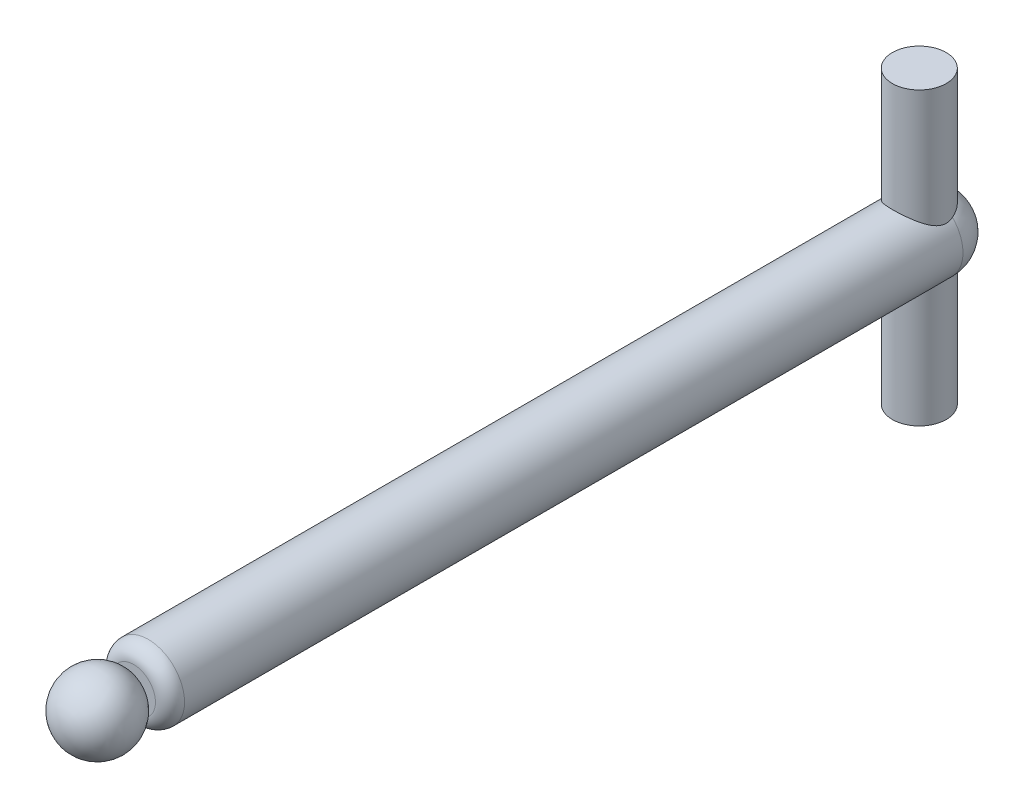
ISO-10303-21;
HEADER;
FILE_DESCRIPTION(('STEP AP214'),'2;1');
FILE_NAME('part.step','',(''),(''),'','','');
FILE_SCHEMA(('AUTOMOTIVE_DESIGN { 1 0 10303 214 1 1 1 1 }'));
ENDSEC;
DATA;
#1=APPLICATION_CONTEXT('core data for automotive mechanical design processes');
#2=APPLICATION_PROTOCOL_DEFINITION('international standard','automotive_design',2000,#1);
#3=PRODUCT_CONTEXT('',#1,'mechanical');
#4=PRODUCT('Part','Part','',(#3));
#5=PRODUCT_RELATED_PRODUCT_CATEGORY('part','',(#4));
#6=PRODUCT_DEFINITION_FORMATION('','',#4);
#7=PRODUCT_DEFINITION_CONTEXT('part definition',#1,'design');
#8=PRODUCT_DEFINITION('design','',#6,#7);
#9=PRODUCT_DEFINITION_SHAPE('','',#8);
#10=(LENGTH_UNIT() NAMED_UNIT(*) SI_UNIT(.MILLI.,.METRE.));
#11=(NAMED_UNIT(*) PLANE_ANGLE_UNIT() SI_UNIT($,.RADIAN.));
#12=(NAMED_UNIT(*) SI_UNIT($,.STERADIAN.) SOLID_ANGLE_UNIT());
#13=UNCERTAINTY_MEASURE_WITH_UNIT(LENGTH_MEASURE(1.E-05),#10,'distance_accuracy_value','');
#14=(GEOMETRIC_REPRESENTATION_CONTEXT(3) GLOBAL_UNCERTAINTY_ASSIGNED_CONTEXT((#13)) GLOBAL_UNIT_ASSIGNED_CONTEXT((#10,
#11,#12)) REPRESENTATION_CONTEXT('',''));
#15=CARTESIAN_POINT('',(0.,0.,0.));
#16=DIRECTION('',(0.,0.,1.));
#17=DIRECTION('',(1.,0.,0.));
#18=AXIS2_PLACEMENT_3D('',#15,#16,#17);
#19=CARTESIAN_POINT('',(0.,0.,59.5));
#20=DIRECTION('',(0.,0.,-1.));
#21=DIRECTION('',(1.,0.,0.));
#22=AXIS2_PLACEMENT_3D('',#19,#20,#21);
#23=SPHERICAL_SURFACE('',#22,2.5);
#24=CARTESIAN_POINT('',(0.,0.,57.));
#25=VERTEX_POINT('',#24);
#26=VERTEX_LOOP('',#25);
#27=FACE_BOUND('',#26,.T.);
#28=ADVANCED_FACE('F40',(#27),#23,.T.);
#29=CLOSED_SHELL('',(#28));
#30=MANIFOLD_SOLID_BREP('B2',#29);
#31=CARTESIAN_POINT('',(0.,0.,27.9123018277174));
#32=DIRECTION('',(0.,0.,-1.));
#33=DIRECTION('',(-1.,0.,0.));
#34=AXIS2_PLACEMENT_3D('',#31,#32,#33);
#35=PLANE('',#34);
#36=CARTESIAN_POINT('',(0.,0.,27.9123018277174));
#37=DIRECTION('',(0.,0.,-1.));
#38=DIRECTION('',(-1.,0.,0.));
#39=AXIS2_PLACEMENT_3D('',#36,#37,#38);
#40=CIRCLE('',#39,1.5);
#41=CARTESIAN_POINT('',(-1.5,0.,27.9123018277174));
#42=VERTEX_POINT('',#41);
#43=EDGE_CURVE('E68',#42,#42,#40,.T.);
#44=ORIENTED_EDGE('',*,*,#43,.T.);
#45=EDGE_LOOP('',(#44));
#46=FACE_BOUND('',#45,.T.);
#47=ADVANCED_FACE('F62',(#46),#35,.T.);
#48=CARTESIAN_POINT('',(0.,0.,29.8405516446947));
#49=DIRECTION('',(0.,0.,-1.));
#50=DIRECTION('',(-1.,0.,0.));
#51=AXIS2_PLACEMENT_3D('',#48,#49,#50);
#52=PLANE('',#51);
#53=CARTESIAN_POINT('',(0.,0.,29.8405516446947));
#54=DIRECTION('',(0.,0.,-1.));
#55=DIRECTION('',(-1.,0.,0.));
#56=AXIS2_PLACEMENT_3D('',#53,#54,#55);
#57=CIRCLE('',#56,1.5);
#58=CARTESIAN_POINT('',(-1.5,0.,29.8405516446947));
#59=VERTEX_POINT('',#58);
#60=EDGE_CURVE('E39',#59,#59,#57,.T.);
#61=ORIENTED_EDGE('',*,*,#60,.F.);
#62=EDGE_LOOP('',(#61));
#63=FACE_BOUND('',#62,.T.);
#64=ADVANCED_FACE('F77',(#63),#52,.F.);
#65=CARTESIAN_POINT('',(0.,0.,57.));
#66=DIRECTION('',(0.,0.,-1.));
#67=DIRECTION('',(-1.,0.,0.));
#68=AXIS2_PLACEMENT_3D('',#65,#66,#67);
#69=CYLINDRICAL_SURFACE('',#68,1.5);
#70=ORIENTED_EDGE('',*,*,#43,.F.);
#71=EDGE_LOOP('',(#70));
#72=FACE_BOUND('',#71,.T.);
#73=ORIENTED_EDGE('',*,*,#60,.T.);
#74=EDGE_LOOP('',(#73));
#75=FACE_BOUND('',#74,.T.);
#76=ADVANCED_FACE('F75',(#72,#75),#69,.T.);
#77=CLOSED_SHELL('',(#47,#64,#76));
#78=MANIFOLD_SOLID_BREP('B6',#77);
#79=CARTESIAN_POINT('',(0.,0.,57.));
#80=DIRECTION('',(0.,0.,-1.));
#81=DIRECTION('',(-1.,0.,0.));
#82=AXIS2_PLACEMENT_3D('',#79,#80,#81);
#83=CYLINDRICAL_SURFACE('',#82,2.5);
#84=CARTESIAN_POINT('',(0.,-2.5,4.85));
#85=CARTESIAN_POINT('',(0.0908037411005618,-2.50000387701624,4.85000414182973));
#86=CARTESIAN_POINT('',(0.181586856565063,-2.49501340434212,4.84327753480377));
#87=CARTESIAN_POINT('',(0.360194310265056,-2.47554724517431,4.81684174873592));
#88=CARTESIAN_POINT('',(0.448017631572467,-2.46106833287443,4.7971281544667));
#89=CARTESIAN_POINT('',(0.617816476306533,-2.42401075779856,4.7460339564));
#90=CARTESIAN_POINT('',(0.699819484177153,-2.40147368869752,4.71471323521834));
#91=CARTESIAN_POINT('',(0.856923811863363,-2.35000506142567,4.64185499930175));
#92=CARTESIAN_POINT('',(0.932024152393716,-2.32107259791315,4.60031603796321));
#93=CARTESIAN_POINT('',(1.08100282258564,-2.25580113417474,4.50416199278347));
#94=CARTESIAN_POINT('',(1.15413751679069,-2.21902623511381,4.44869710084186));
#95=CARTESIAN_POINT('',(1.29069231769546,-2.1424880792677,4.32849700726975));
#96=CARTESIAN_POINT('',(1.3540977041287,-2.10272042737369,4.26374803978792));
#97=CARTESIAN_POINT('',(1.48231472194717,-2.01491899975568,4.1121920365579));
#98=CARTESIAN_POINT('',(1.54492109406323,-1.96680693589834,4.02355561252696));
#99=CARTESIAN_POINT('',(1.65454189706459,-1.87551483927527,3.83478683265235));
#100=CARTESIAN_POINT('',(1.70157864027352,-1.83232780733836,3.73467120693063));
#101=CARTESIAN_POINT('',(1.76501686619427,-1.77086778102456,3.55922310480562));
#102=CARTESIAN_POINT('',(1.78639994566694,-1.74910566538276,3.48693105572161));
#103=CARTESIAN_POINT('',(1.82036398081376,-1.7137333366899,3.33845011099936));
#104=CARTESIAN_POINT('',(1.83296503133245,-1.70010452354241,3.26227054259241));
#105=CARTESIAN_POINT('',(1.84855248437103,-1.68315264087127,3.10709233533062));
#106=CARTESIAN_POINT('',(1.85145948025082,-1.67991469384006,3.02807574735096));
#107=CARTESIAN_POINT('',(1.84715394119453,-1.68464452723504,2.87063866821601));
#108=CARTESIAN_POINT('',(1.83993519273003,-1.69261918813617,2.79221857278742));
#109=CARTESIAN_POINT('',(1.81481067069801,-1.71954038855883,2.63080964317656));
#110=CARTESIAN_POINT('',(1.79590101842848,-1.73951183908506,2.54815704643441));
#111=CARTESIAN_POINT('',(1.74795837905897,-1.78767691807979,2.38832957068304));
#112=CARTESIAN_POINT('',(1.71890099472936,-1.81589033495432,2.3111684373647));
#113=CARTESIAN_POINT('',(1.63958740487909,-1.88827191133527,2.13595043173789));
#114=CARTESIAN_POINT('',(1.58546481691831,-1.93450956015681,2.04051006784806));
#115=CARTESIAN_POINT('',(1.46208652721486,-2.02938131468566,1.86129289055596));
#116=CARTESIAN_POINT('',(1.39281274078821,-2.07801822999833,1.77753021313445));
#117=CARTESIAN_POINT('',(1.23860828976679,-2.17352568805819,1.62138807552877));
#118=CARTESIAN_POINT('',(1.15344666157652,-2.22035596466481,1.54921029645904));
#119=CARTESIAN_POINT('',(0.969101681735234,-2.30676108056195,1.42014805763366));
#120=CARTESIAN_POINT('',(0.869951047354383,-2.34635236783227,1.36322878762448));
#121=CARTESIAN_POINT('',(0.686437547780426,-2.40532512381139,1.27990965243991));
#122=CARTESIAN_POINT('',(0.604753557128842,-2.42728567387609,1.2494284113037));
#123=CARTESIAN_POINT('',(0.436259723251394,-2.46314287399148,1.20003763216507));
#124=CARTESIAN_POINT('',(0.349453732455603,-2.47704550160282,1.18111951578878));
#125=CARTESIAN_POINT('',(0.1726562398483,-2.49561990796897,1.15590337782855));
#126=CARTESIAN_POINT('',(0.0826529964801484,-2.50025307592049,1.14965814204996));
#127=CARTESIAN_POINT('',(-0.0972746053877477,-2.49972554491027,1.15037074877488));
#128=CARTESIAN_POINT('',(-0.187198966313853,-2.49456515857203,1.15732816983176));
#129=CARTESIAN_POINT('',(-0.358245071277375,-2.47559809437806,1.18309214263269));
#130=CARTESIAN_POINT('',(-0.439557650657773,-2.46237969395701,1.20109299280203));
#131=CARTESIAN_POINT('',(-0.597676583051945,-2.42885176111822,1.24726722438432));
#132=CARTESIAN_POINT('',(-0.674481981775963,-2.40854073328504,1.27544275107729));
#133=CARTESIAN_POINT('',(-0.827805535400965,-2.36043886159826,1.34326022029349));
#134=CARTESIAN_POINT('',(-0.903869992182026,-2.33220123435144,1.38360373297371));
#135=CARTESIAN_POINT('',(-1.04833308326245,-2.27093934183829,1.4733240178569));
#136=CARTESIAN_POINT('',(-1.11672736130087,-2.23791238065133,1.5227058818883));
#137=CARTESIAN_POINT('',(-1.25715775043202,-2.16263828931728,1.63917749908106));
#138=CARTESIAN_POINT('',(-1.32756528352806,-2.11981052291986,1.70785396620858));
#139=CARTESIAN_POINT('',(-1.4565575339626,-2.03334010477991,1.85520939885789));
#140=CARTESIAN_POINT('',(-1.51512976325952,-1.98969664483973,1.93389878837245));
#141=CARTESIAN_POINT('',(-1.6156686884501,-1.90878111419462,2.09425971851787));
#142=CARTESIAN_POINT('',(-1.65857186677125,-1.87127746657761,2.17522477930214));
#143=CARTESIAN_POINT('',(-1.73261717054205,-1.80293495367251,2.34496541981192));
#144=CARTESIAN_POINT('',(-1.76378345509034,-1.77208245435838,2.43372448655538));
#145=CARTESIAN_POINT('',(-1.80662948856402,-1.72823449695806,2.5953441629559));
#146=CARTESIAN_POINT('',(-1.82121897849959,-1.71271191751858,2.66673024725442));
#147=CARTESIAN_POINT('',(-1.84188151212421,-1.69047699322332,2.81202618441482));
#148=CARTESIAN_POINT('',(-1.84796895309747,-1.68374975566162,2.88593155314593));
#149=CARTESIAN_POINT('',(-1.85117366684881,-1.68022763681263,3.0344197784039));
#150=CARTESIAN_POINT('',(-1.84826288222371,-1.68346382238687,3.1090040295376));
#151=CARTESIAN_POINT('',(-1.83365828289283,-1.69935401295355,3.25631306629406));
#152=CARTESIAN_POINT('',(-1.82195242223173,-1.71202093430047,3.32903516007113));
#153=CARTESIAN_POINT('',(-1.78635459996089,-1.7492146223623,3.48980369573146));
#154=CARTESIAN_POINT('',(-1.76004846371157,-1.77600064790375,3.57677723375518));
#155=CARTESIAN_POINT('',(-1.69627237975545,-1.83701003674836,3.74377053384609));
#156=CARTESIAN_POINT('',(-1.65877478462615,-1.87125176130957,3.82377243330833));
#157=CARTESIAN_POINT('',(-1.56107806384767,-1.95403468107918,3.99919926181548));
#158=CARTESIAN_POINT('',(-1.4974440402703,-2.00379991511226,4.09213480402335));
#159=CARTESIAN_POINT('',(-1.3544289055526,-2.103123596557,4.26515616161268));
#160=CARTESIAN_POINT('',(-1.27503826591533,-2.15268190022473,4.34523414837743));
#161=CARTESIAN_POINT('',(-1.10081905959608,-2.24678421861618,4.49119001955959));
#162=CARTESIAN_POINT('',(-1.00593380501705,-2.29130876473617,4.55701361514183));
#163=CARTESIAN_POINT('',(-0.802375361391734,-2.37023800481386,4.67099169726627));
#164=CARTESIAN_POINT('',(-0.693735220592625,-2.40466631988959,4.71918749221087));
#165=CARTESIAN_POINT('',(-0.487957613261007,-2.45373938378234,4.78711184312141));
#166=CARTESIAN_POINT('',(-0.392652250176831,-2.4709210874987,4.81054107315195));
#167=CARTESIAN_POINT('',(-0.198220207953497,-2.49404314441457,4.84197447230654));
#168=CARTESIAN_POINT('',(-0.0990978211568789,-2.49999576885427,4.84999547985252));
#169=CARTESIAN_POINT('',(0.,-2.5,4.85));
#170=B_SPLINE_CURVE_WITH_KNOTS('',3,(#84,#85,#86,#87,#88,#89,#90,#91,#92,#93,#94,#95,#96,#97,
#98,#99,#100,#101,#102,#103,#104,#105,#106,#107,#108,#109,#110,#111,#112,#113,#114,#115,#116,
#117,#118,#119,#120,#121,#122,#123,#124,#125,#126,#127,#128,#129,#130,#131,#132,#133,#134,#135,
#136,#137,#138,#139,#140,#141,#142,#143,#144,#145,#146,#147,#148,#149,#150,#151,#152,#153,#154,
#155,#156,#157,#158,#159,#160,#161,#162,#163,#164,#165,#166,#167,#168,#169),.UNSPECIFIED.,.T.,
.F.,(4,2,2,2,2,2,2,2,2,2,2,2,2,2,2,2,2,2,2,2,2,2,2,2,2,2,2,2,2,2,2,2,2,2,2,2,2,2,2,2,2,2,4),(0.,
0.272006671725052,0.544105866178727,0.814820378481081,1.08557323811005,1.38115533668075,
1.67718032732562,2.03179266962076,2.38589460601553,2.62047932227766,2.8545254888537,
3.09048414291858,3.32658765323392,3.58648972414884,3.84702100424682,4.20237840203124,
4.55816229700147,4.91959079102965,5.28018757822172,5.54880713770459,5.81722717285043,
6.08676297029442,6.35629016393656,6.60816893561277,6.86010084571472,7.13093030443569,
7.40191280938673,7.72254306220105,8.04350988198216,8.33954399458902,8.63496537906834,
8.85756227031097,9.07978175929555,9.302694849889,9.52591380562473,9.80854391608466,
10.091878099134,10.459478396808,10.8273016744564,11.1965021111849,11.5648317471251,
11.8620086531731,12.1588606130305),.UNSPECIFIED.);
#171=CARTESIAN_POINT('',(-1.78115131305569,-1.75428047928488,2.5));
#172=VERTEX_POINT('',#171);
#173=CARTESIAN_POINT('',(1.78115131305569,-1.75428047928488,2.5));
#174=VERTEX_POINT('',#173);
#175=EDGE_CURVE('E137',#172,#174,#170,.T.);
#176=ORIENTED_EDGE('',*,*,#175,.T.);
#177=CARTESIAN_POINT('',(0.,0.,2.5));
#178=DIRECTION('',(0.,0.,-1.));
#179=DIRECTION('',(-1.,0.,0.));
#180=AXIS2_PLACEMENT_3D('',#177,#178,#179);
#181=CIRCLE('',#180,2.5);
#182=CARTESIAN_POINT('',(1.78115131305569,1.75428047928488,2.5));
#183=VERTEX_POINT('',#182);
#184=EDGE_CURVE('E140',#174,#183,#181,.F.);
#185=ORIENTED_EDGE('',*,*,#184,.T.);
#186=CARTESIAN_POINT('',(0.,2.5,4.85));
#187=CARTESIAN_POINT('',(-0.0908037411005616,2.50000387701624,4.85000414182973));
#188=CARTESIAN_POINT('',(-0.181586856565063,2.49501340434212,4.84327753480377));
#189=CARTESIAN_POINT('',(-0.360194310265056,2.47554724517431,4.81684174873592));
#190=CARTESIAN_POINT('',(-0.448017631572467,2.46106833287443,4.7971281544667));
#191=CARTESIAN_POINT('',(-0.617816476306533,2.42401075779856,4.7460339564));
#192=CARTESIAN_POINT('',(-0.699819484177153,2.40147368869752,4.71471323521834));
#193=CARTESIAN_POINT('',(-0.856923811863363,2.35000506142567,4.64185499930175));
#194=CARTESIAN_POINT('',(-0.932024152393715,2.32107259791315,4.60031603796321));
#195=CARTESIAN_POINT('',(-1.08100282258564,2.25580113417474,4.50416199278347));
#196=CARTESIAN_POINT('',(-1.15413751679069,2.21902623511381,4.44869710084186));
#197=CARTESIAN_POINT('',(-1.29069231769546,2.1424880792677,4.32849700726975));
#198=CARTESIAN_POINT('',(-1.3540977041287,2.10272042737369,4.26374803978792));
#199=CARTESIAN_POINT('',(-1.48231472194717,2.01491899975568,4.1121920365579));
#200=CARTESIAN_POINT('',(-1.54492109406323,1.96680693589834,4.02355561252696));
#201=CARTESIAN_POINT('',(-1.65454189706459,1.87551483927527,3.83478683265235));
#202=CARTESIAN_POINT('',(-1.70157864027352,1.83232780733836,3.73467120693063));
#203=CARTESIAN_POINT('',(-1.76501686619427,1.77086778102456,3.55922310480562));
#204=CARTESIAN_POINT('',(-1.78639994566694,1.74910566538276,3.48693105572161));
#205=CARTESIAN_POINT('',(-1.82036398081376,1.7137333366899,3.33845011099936));
#206=CARTESIAN_POINT('',(-1.83296503133245,1.70010452354241,3.26227054259241));
#207=CARTESIAN_POINT('',(-1.84855248437103,1.68315264087127,3.10709233533062));
#208=CARTESIAN_POINT('',(-1.85145948025082,1.67991469384006,3.02807574735096));
#209=CARTESIAN_POINT('',(-1.84715394119453,1.68464452723504,2.87063866821601));
#210=CARTESIAN_POINT('',(-1.83993519273003,1.69261918813617,2.79221857278742));
#211=CARTESIAN_POINT('',(-1.81481067069801,1.71954038855883,2.63080964317656));
#212=CARTESIAN_POINT('',(-1.79590101842848,1.73951183908506,2.54815704643441));
#213=CARTESIAN_POINT('',(-1.74795837905897,1.78767691807979,2.38832957068304));
#214=CARTESIAN_POINT('',(-1.71890099472936,1.81589033495432,2.3111684373647));
#215=CARTESIAN_POINT('',(-1.63958740487909,1.88827191133527,2.13595043173789));
#216=CARTESIAN_POINT('',(-1.58546481691831,1.93450956015681,2.04051006784806));
#217=CARTESIAN_POINT('',(-1.46208652721486,2.02938131468566,1.86129289055596));
#218=CARTESIAN_POINT('',(-1.39281274078821,2.07801822999833,1.77753021313445));
#219=CARTESIAN_POINT('',(-1.23860828976679,2.17352568805819,1.62138807552877));
#220=CARTESIAN_POINT('',(-1.15344666157652,2.22035596466481,1.54921029645904));
#221=CARTESIAN_POINT('',(-0.969101681735234,2.30676108056195,1.42014805763366));
#222=CARTESIAN_POINT('',(-0.869951047354383,2.34635236783227,1.36322878762448));
#223=CARTESIAN_POINT('',(-0.686437547780426,2.40532512381139,1.27990965243991));
#224=CARTESIAN_POINT('',(-0.604753557128842,2.42728567387609,1.2494284113037));
#225=CARTESIAN_POINT('',(-0.436259723251394,2.46314287399148,1.20003763216507));
#226=CARTESIAN_POINT('',(-0.349453732455603,2.47704550160282,1.18111951578878));
#227=CARTESIAN_POINT('',(-0.1726562398483,2.49561990796897,1.15590337782855));
#228=CARTESIAN_POINT('',(-0.0826529964801484,2.50025307592049,1.14965814204996));
#229=CARTESIAN_POINT('',(0.0972746053877477,2.49972554491027,1.15037074877488));
#230=CARTESIAN_POINT('',(0.187198966313853,2.49456515857203,1.15732816983176));
#231=CARTESIAN_POINT('',(0.358245071277375,2.47559809437806,1.18309214263269));
#232=CARTESIAN_POINT('',(0.439557650657773,2.46237969395701,1.20109299280203));
#233=CARTESIAN_POINT('',(0.597676583051945,2.42885176111822,1.24726722438432));
#234=CARTESIAN_POINT('',(0.674481981775963,2.40854073328504,1.27544275107729));
#235=CARTESIAN_POINT('',(0.827805535400965,2.36043886159826,1.34326022029349));
#236=CARTESIAN_POINT('',(0.903869992182026,2.33220123435144,1.38360373297371));
#237=CARTESIAN_POINT('',(1.04833308326245,2.27093934183829,1.4733240178569));
#238=CARTESIAN_POINT('',(1.11672736130087,2.23791238065133,1.5227058818883));
#239=CARTESIAN_POINT('',(1.25715775043202,2.16263828931728,1.63917749908106));
#240=CARTESIAN_POINT('',(1.32756528352806,2.11981052291986,1.70785396620858));
#241=CARTESIAN_POINT('',(1.4565575339626,2.03334010477991,1.85520939885789));
#242=CARTESIAN_POINT('',(1.51512976325952,1.98969664483973,1.93389878837245));
#243=CARTESIAN_POINT('',(1.6156686884501,1.90878111419462,2.09425971851787));
#244=CARTESIAN_POINT('',(1.65857186677125,1.87127746657761,2.17522477930214));
#245=CARTESIAN_POINT('',(1.73261717054205,1.80293495367251,2.34496541981192));
#246=CARTESIAN_POINT('',(1.76378345509034,1.77208245435838,2.43372448655538));
#247=CARTESIAN_POINT('',(1.80662948856402,1.72823449695806,2.5953441629559));
#248=CARTESIAN_POINT('',(1.82121897849959,1.71271191751858,2.66673024725442));
#249=CARTESIAN_POINT('',(1.84188151212421,1.69047699322332,2.81202618441482));
#250=CARTESIAN_POINT('',(1.84796895309747,1.68374975566162,2.88593155314593));
#251=CARTESIAN_POINT('',(1.85117366684881,1.68022763681263,3.0344197784039));
#252=CARTESIAN_POINT('',(1.84826288222371,1.68346382238687,3.1090040295376));
#253=CARTESIAN_POINT('',(1.83365828289283,1.69935401295355,3.25631306629406));
#254=CARTESIAN_POINT('',(1.82195242223173,1.71202093430047,3.32903516007113));
#255=CARTESIAN_POINT('',(1.78635459996089,1.7492146223623,3.48980369573146));
#256=CARTESIAN_POINT('',(1.76004846371157,1.77600064790375,3.57677723375518));
#257=CARTESIAN_POINT('',(1.69627237975545,1.83701003674836,3.74377053384609));
#258=CARTESIAN_POINT('',(1.65877478462615,1.87125176130957,3.82377243330833));
#259=CARTESIAN_POINT('',(1.56107806384767,1.95403468107918,3.99919926181548));
#260=CARTESIAN_POINT('',(1.4974440402703,2.00379991511226,4.09213480402335));
#261=CARTESIAN_POINT('',(1.3544289055526,2.103123596557,4.26515616161268));
#262=CARTESIAN_POINT('',(1.27503826591533,2.15268190022473,4.34523414837743));
#263=CARTESIAN_POINT('',(1.10081905959608,2.24678421861618,4.49119001955959));
#264=CARTESIAN_POINT('',(1.00593380501705,2.29130876473617,4.55701361514183));
#265=CARTESIAN_POINT('',(0.802375361391734,2.37023800481386,4.67099169726627));
#266=CARTESIAN_POINT('',(0.693735220592625,2.40466631988959,4.71918749221087));
#267=CARTESIAN_POINT('',(0.487957613261007,2.45373938378234,4.78711184312141));
#268=CARTESIAN_POINT('',(0.392652250176831,2.4709210874987,4.81054107315195));
#269=CARTESIAN_POINT('',(0.198220207953497,2.49404314441457,4.84197447230654));
#270=CARTESIAN_POINT('',(0.0990978211568788,2.49999576885427,4.84999547985252));
#271=CARTESIAN_POINT('',(0.,2.5,4.85));
#272=B_SPLINE_CURVE_WITH_KNOTS('',3,(#186,#187,#188,#189,#190,#191,#192,#193,#194,#195,#196,
#197,#198,#199,#200,#201,#202,#203,#204,#205,#206,#207,#208,#209,#210,#211,#212,#213,#214,#215,
#216,#217,#218,#219,#220,#221,#222,#223,#224,#225,#226,#227,#228,#229,#230,#231,#232,#233,#234,
#235,#236,#237,#238,#239,#240,#241,#242,#243,#244,#245,#246,#247,#248,#249,#250,#251,#252,#253,
#254,#255,#256,#257,#258,#259,#260,#261,#262,#263,#264,#265,#266,#267,#268,#269,#270,#271),
.UNSPECIFIED.,.T.,.F.,(4,2,2,2,2,2,2,2,2,2,2,2,2,2,2,2,2,2,2,2,2,2,2,2,2,2,2,2,2,2,2,2,2,2,2,2,
2,2,2,2,2,2,4),(0.,0.272006671725051,0.544105866178727,0.814820378481081,1.08557323811005,
1.38115533668075,1.67718032732562,2.03179266962076,2.38589460601553,2.62047932227766,
2.8545254888537,3.09048414291858,3.32658765323392,3.58648972414884,3.84702100424682,
4.20237840203124,4.55816229700147,4.91959079102965,5.28018757822172,5.54880713770459,
5.81722717285043,6.08676297029442,6.35629016393656,6.60816893561277,6.86010084571472,
7.13093030443569,7.40191280938673,7.72254306220105,8.04350988198216,8.33954399458902,
8.63496537906834,8.85756227031097,9.07978175929555,9.302694849889,9.52591380562473,
9.80854391608466,10.091878099134,10.459478396808,10.8273016744564,11.1965021111849,
11.5648317471251,11.8620086531731,12.1588606130305),.UNSPECIFIED.);
#273=CARTESIAN_POINT('',(-1.78115131305569,1.75428047928488,2.5));
#274=VERTEX_POINT('',#273);
#275=EDGE_CURVE('E143',#183,#274,#272,.T.);
#276=ORIENTED_EDGE('',*,*,#275,.T.);
#277=CARTESIAN_POINT('',(0.,0.,2.5));
#278=DIRECTION('',(0.,0.,-1.));
#279=DIRECTION('',(-1.,0.,0.));
#280=AXIS2_PLACEMENT_3D('',#277,#278,#279);
#281=CIRCLE('',#280,2.5);
#282=EDGE_CURVE('E141',#274,#172,#281,.F.);
#283=ORIENTED_EDGE('',*,*,#282,.T.);
#284=EDGE_LOOP('',(#176,#185,#276,#283));
#285=FACE_BOUND('',#284,.T.);
#286=CARTESIAN_POINT('',(0.,0.,56.));
#287=DIRECTION('',(0.,0.,1.));
#288=DIRECTION('',(1.,0.,0.));
#289=AXIS2_PLACEMENT_3D('',#286,#287,#288);
#290=CIRCLE('',#289,2.5);
#291=CARTESIAN_POINT('',(2.5,0.,56.));
#292=VERTEX_POINT('',#291);
#293=EDGE_CURVE('E146',#292,#292,#290,.F.);
#294=ORIENTED_EDGE('',*,*,#293,.T.);
#295=EDGE_LOOP('',(#294));
#296=FACE_BOUND('',#295,.T.);
#297=ADVANCED_FACE('F103',(#285,#296),#83,.T.);
#298=CARTESIAN_POINT('',(0.,0.,57.));
#299=DIRECTION('',(0.,0.,1.));
#300=DIRECTION('',(1.,0.,0.));
#301=AXIS2_PLACEMENT_3D('',#298,#299,#300);
#302=PLANE('',#301);
#303=CARTESIAN_POINT('',(0.,0.,57.));
#304=DIRECTION('',(0.,0.,1.));
#305=DIRECTION('',(1.,0.,0.));
#306=AXIS2_PLACEMENT_3D('',#303,#304,#305);
#307=CIRCLE('',#306,1.5);
#308=CARTESIAN_POINT('',(1.5,0.,57.));
#309=VERTEX_POINT('',#308);
#310=EDGE_CURVE('E142',#309,#309,#307,.T.);
#311=ORIENTED_EDGE('',*,*,#310,.T.);
#312=EDGE_LOOP('',(#311));
#313=FACE_BOUND('',#312,.T.);
#314=ADVANCED_FACE('F159',(#313),#302,.T.);
#315=CARTESIAN_POINT('',(0.,0.,56.));
#316=DIRECTION('',(0.,0.,1.));
#317=DIRECTION('',(1.,0.,0.));
#318=AXIS2_PLACEMENT_3D('',#315,#316,#317);
#319=TOROIDAL_SURFACE('',#318,1.5,1.);
#320=ORIENTED_EDGE('',*,*,#293,.F.);
#321=EDGE_LOOP('',(#320));
#322=FACE_BOUND('',#321,.T.);
#323=ORIENTED_EDGE('',*,*,#310,.F.);
#324=EDGE_LOOP('',(#323));
#325=FACE_BOUND('',#324,.T.);
#326=ADVANCED_FACE('F172',(#322,#325),#319,.T.);
#327=CARTESIAN_POINT('',(0.,10.,3.));
#328=DIRECTION('',(0.,1.,0.));
#329=DIRECTION('',(0.,0.,1.));
#330=AXIS2_PLACEMENT_3D('',#327,#328,#329);
#331=PLANE('',#330);
#332=CARTESIAN_POINT('',(0.,10.,3.));
#333=DIRECTION('',(0.,1.,0.));
#334=DIRECTION('',(0.,0.,1.));
#335=AXIS2_PLACEMENT_3D('',#332,#333,#334);
#336=CIRCLE('',#335,1.85);
#337=CARTESIAN_POINT('',(0.,10.,4.85));
#338=VERTEX_POINT('',#337);
#339=EDGE_CURVE('E193',#338,#338,#336,.T.);
#340=ORIENTED_EDGE('',*,*,#339,.T.);
#341=EDGE_LOOP('',(#340));
#342=FACE_BOUND('',#341,.T.);
#343=ADVANCED_FACE('F175',(#342),#331,.T.);
#344=CARTESIAN_POINT('',(0.,-10.,3.));
#345=DIRECTION('',(0.,1.,0.));
#346=DIRECTION('',(0.,0.,1.));
#347=AXIS2_PLACEMENT_3D('',#344,#345,#346);
#348=CYLINDRICAL_SURFACE('',#347,1.85);
#349=ORIENTED_EDGE('',*,*,#339,.F.);
#350=EDGE_LOOP('',(#349));
#351=FACE_BOUND('',#350,.T.);
#352=ORIENTED_EDGE('',*,*,#275,.F.);
#353=CARTESIAN_POINT('',(1.78115131305569,1.75428047928488,2.5));
#354=CARTESIAN_POINT('',(1.76710058675012,1.76854587312827,2.44994941524433));
#355=CARTESIAN_POINT('',(1.75092225395561,1.78248611378104,2.40042805303476));
#356=CARTESIAN_POINT('',(1.71437249571935,1.80967652664199,2.30275573071063));
#357=CARTESIAN_POINT('',(1.69400055911865,1.82292661448042,2.25460493847022));
#358=CARTESIAN_POINT('',(1.6267078126766,1.8615686513401,2.1127248674637));
#359=CARTESIAN_POINT('',(1.57360100552128,1.88586154162609,2.02153550777989));
#360=CARTESIAN_POINT('',(1.45211214495975,1.93109222551692,1.84889646438568));
#361=CARTESIAN_POINT('',(1.38371030549637,1.95202561237912,1.76745960821967));
#362=CARTESIAN_POINT('',(1.2334670644207,1.99015969948988,1.61712787517141));
#363=CARTESIAN_POINT('',(1.15163478379201,2.00736291472274,1.54822455291677));
#364=CARTESIAN_POINT('',(0.978953771770452,2.03738571991971,1.42677974446236));
#365=CARTESIAN_POINT('',(0.888373638231622,2.05030199466579,1.37388017486995));
#366=CARTESIAN_POINT('',(0.699155081305317,2.07210457875492,1.28400184937293));
#367=CARTESIAN_POINT('',(0.600515789967888,2.08099045335759,1.24702481097885));
#368=CARTESIAN_POINT('',(0.400690139105801,2.09440530317934,1.19101034012447));
#369=CARTESIAN_POINT('',(0.29963099710197,2.09903863276843,1.1715434750478));
#370=CARTESIAN_POINT('',(0.0955943239700594,2.10425315558351,1.14962560375011));
#371=CARTESIAN_POINT('',(-0.0073828350662439,2.10483512672259,1.14717133089228));
#372=CARTESIAN_POINT('',(-0.210972538549858,2.10195735271765,1.15927718855156));
#373=CARTESIAN_POINT('',(-0.311598544150138,2.09854815818487,1.17362451696438));
#374=CARTESIAN_POINT('',(-0.508957749163906,2.08782608747991,1.21851082793729));
#375=CARTESIAN_POINT('',(-0.605690747751336,2.0805130101975,1.24905064465993));
#376=CARTESIAN_POINT('',(-0.792761366953206,2.0620806423645,1.325408269853));
#377=CARTESIAN_POINT('',(-0.883085566328297,2.05095363308856,1.3712570560728));
#378=CARTESIAN_POINT('',(-1.05468669850434,2.02507130178285,1.47675331044046));
#379=CARTESIAN_POINT('',(-1.13596392749522,2.01031609858776,1.53640032664935));
#380=CARTESIAN_POINT('',(-1.28860320967756,1.97713972179692,1.66869774307618));
#381=CARTESIAN_POINT('',(-1.35978683428904,1.95866393083068,1.74154002169259));
#382=CARTESIAN_POINT('',(-1.48893777127461,1.91847281862052,1.89736529126325));
#383=CARTESIAN_POINT('',(-1.54690352471252,1.89675711575551,1.98034947659871));
#384=CARTESIAN_POINT('',(-1.63745696319684,1.85537238923215,2.13542492880248));
#385=CARTESIAN_POINT('',(-1.67282054155944,1.83625494865695,2.20606364786178));
#386=CARTESIAN_POINT('',(-1.73411537163477,1.79642632655997,2.35074972678324));
#387=CARTESIAN_POINT('',(-1.76006216870444,1.77571784068498,2.42479123946031));
#388=CARTESIAN_POINT('',(-1.78115131305569,1.75428047928488,2.5));
#389=B_SPLINE_CURVE_WITH_KNOTS('',3,(#353,#354,#355,#356,#357,#358,#359,#360,#361,#362,#363,
#364,#365,#366,#367,#368,#369,#370,#371,#372,#373,#374,#375,#376,#377,#378,#379,#380,#381,#382,
#383,#384,#385,#386,#387,#388),.UNSPECIFIED.,.F.,.F.,(4,2,2,2,2,2,2,2,2,2,2,2,2,2,2,2,2,4),(0.,
0.161628733817914,0.323277180262845,0.646470798193981,0.970084951881879,1.29348023283485,
1.60898773186136,1.92452925511353,2.23210271213491,2.53961710945491,2.84327840664623,
3.14695534859141,3.45125054381999,3.75553577375676,4.06466472710674,4.37383012076827,
4.61704441861785,4.85985536866121),.UNSPECIFIED.);
#390=EDGE_CURVE('E116',#183,#274,#389,.T.);
#391=ORIENTED_EDGE('',*,*,#390,.T.);
#392=EDGE_LOOP('',(#352,#391));
#393=FACE_BOUND('',#392,.T.);
#394=ADVANCED_FACE('F156',(#351,#393),#348,.T.);
#395=CARTESIAN_POINT('',(0.,-10.,3.));
#396=DIRECTION('',(0.,1.,0.));
#397=DIRECTION('',(0.,0.,1.));
#398=AXIS2_PLACEMENT_3D('',#395,#396,#397);
#399=CIRCLE('',#398,1.85);
#400=CARTESIAN_POINT('',(0.,-10.,4.85));
#401=VERTEX_POINT('',#400);
#402=EDGE_CURVE('E190',#401,#401,#399,.T.);
#403=ORIENTED_EDGE('',*,*,#402,.T.);
#404=EDGE_LOOP('',(#403));
#405=FACE_BOUND('',#404,.T.);
#406=ORIENTED_EDGE('',*,*,#175,.F.);
#407=CARTESIAN_POINT('',(-1.78115131305569,-1.75428047928488,2.5));
#408=CARTESIAN_POINT('',(-1.76710058675012,-1.76854587312827,2.44994941524433));
#409=CARTESIAN_POINT('',(-1.75092225395561,-1.78248611378104,2.40042805303476));
#410=CARTESIAN_POINT('',(-1.71437249571935,-1.80967652664199,2.30275573071063));
#411=CARTESIAN_POINT('',(-1.69400055911865,-1.82292661448042,2.25460493847022));
#412=CARTESIAN_POINT('',(-1.6267078126766,-1.8615686513401,2.1127248674637));
#413=CARTESIAN_POINT('',(-1.57360100552128,-1.88586154162609,2.02153550777989));
#414=CARTESIAN_POINT('',(-1.45211214495975,-1.93109222551692,1.84889646438568));
#415=CARTESIAN_POINT('',(-1.38371030549637,-1.95202561237912,1.76745960821967));
#416=CARTESIAN_POINT('',(-1.2334670644207,-1.99015969948988,1.61712787517141));
#417=CARTESIAN_POINT('',(-1.15163478379201,-2.00736291472274,1.54822455291677));
#418=CARTESIAN_POINT('',(-0.978953771770452,-2.03738571991971,1.42677974446236));
#419=CARTESIAN_POINT('',(-0.888373638231622,-2.05030199466579,1.37388017486995));
#420=CARTESIAN_POINT('',(-0.699155081305317,-2.07210457875492,1.28400184937293));
#421=CARTESIAN_POINT('',(-0.600515789967888,-2.08099045335759,1.24702481097885));
#422=CARTESIAN_POINT('',(-0.400690139105801,-2.09440530317934,1.19101034012447));
#423=CARTESIAN_POINT('',(-0.29963099710197,-2.09903863276843,1.1715434750478));
#424=CARTESIAN_POINT('',(-0.0955943239700594,-2.10425315558351,1.14962560375011));
#425=CARTESIAN_POINT('',(0.0073828350662439,-2.10483512672259,1.14717133089228));
#426=CARTESIAN_POINT('',(0.210972538549858,-2.10195735271765,1.15927718855156));
#427=CARTESIAN_POINT('',(0.311598544150138,-2.09854815818487,1.17362451696438));
#428=CARTESIAN_POINT('',(0.508957749163906,-2.08782608747991,1.21851082793729));
#429=CARTESIAN_POINT('',(0.605690747751336,-2.0805130101975,1.24905064465993));
#430=CARTESIAN_POINT('',(0.792761366953206,-2.0620806423645,1.325408269853));
#431=CARTESIAN_POINT('',(0.883085566328297,-2.05095363308856,1.3712570560728));
#432=CARTESIAN_POINT('',(1.05468669850434,-2.02507130178285,1.47675331044046));
#433=CARTESIAN_POINT('',(1.13596392749522,-2.01031609858776,1.53640032664935));
#434=CARTESIAN_POINT('',(1.28860320967756,-1.97713972179692,1.66869774307618));
#435=CARTESIAN_POINT('',(1.35978683428904,-1.95866393083068,1.74154002169259));
#436=CARTESIAN_POINT('',(1.48893777127461,-1.91847281862052,1.89736529126325));
#437=CARTESIAN_POINT('',(1.54690352471252,-1.89675711575551,1.98034947659871));
#438=CARTESIAN_POINT('',(1.63745696319684,-1.85537238923215,2.13542492880248));
#439=CARTESIAN_POINT('',(1.67282054155944,-1.83625494865695,2.20606364786178));
#440=CARTESIAN_POINT('',(1.73411537163477,-1.79642632655997,2.35074972678324));
#441=CARTESIAN_POINT('',(1.76006216870444,-1.77571784068498,2.42479123946031));
#442=CARTESIAN_POINT('',(1.78115131305569,-1.75428047928488,2.5));
#443=B_SPLINE_CURVE_WITH_KNOTS('',3,(#407,#408,#409,#410,#411,#412,#413,#414,#415,#416,#417,
#418,#419,#420,#421,#422,#423,#424,#425,#426,#427,#428,#429,#430,#431,#432,#433,#434,#435,#436,
#437,#438,#439,#440,#441,#442),.UNSPECIFIED.,.F.,.F.,(4,2,2,2,2,2,2,2,2,2,2,2,2,2,2,2,2,4),(0.,
0.161628733817914,0.323277180262845,0.646470798193981,0.970084951881879,1.29348023283485,
1.60898773186136,1.92452925511353,2.23210271213491,2.53961710945491,2.84327840664623,
3.14695534859141,3.45125054381999,3.75553577375676,4.06466472710674,4.37383012076827,
4.61704441861785,4.85985536866121),.UNSPECIFIED.);
#444=EDGE_CURVE('E60',#172,#174,#443,.T.);
#445=ORIENTED_EDGE('',*,*,#444,.T.);
#446=EDGE_LOOP('',(#406,#445));
#447=FACE_BOUND('',#446,.T.);
#448=ADVANCED_FACE('F136',(#405,#447),#348,.T.);
#449=CARTESIAN_POINT('',(0.,-10.,3.));
#450=DIRECTION('',(0.,1.,0.));
#451=DIRECTION('',(0.,0.,1.));
#452=AXIS2_PLACEMENT_3D('',#449,#450,#451);
#453=PLANE('',#452);
#454=ORIENTED_EDGE('',*,*,#402,.F.);
#455=EDGE_LOOP('',(#454));
#456=FACE_BOUND('',#455,.T.);
#457=ADVANCED_FACE('F155',(#456),#453,.F.);
#458=CARTESIAN_POINT('',(0.,0.,2.5));
#459=DIRECTION('',(0.,0.,1.));
#460=DIRECTION('',(1.,0.,0.));
#461=AXIS2_PLACEMENT_3D('',#458,#459,#460);
#462=SPHERICAL_SURFACE('',#461,2.5);
#463=ORIENTED_EDGE('',*,*,#390,.F.);
#464=ORIENTED_EDGE('',*,*,#184,.F.);
#465=ORIENTED_EDGE('',*,*,#444,.F.);
#466=ORIENTED_EDGE('',*,*,#282,.F.);
#467=EDGE_LOOP('',(#463,#464,#465,#466));
#468=FACE_BOUND('',#467,.T.);
#469=ADVANCED_FACE('F105',(#468),#462,.T.);
#470=CLOSED_SHELL('',(#297,#314,#326,#343,#394,#448,#457,#469));
#471=MANIFOLD_SOLID_BREP('B34',#470);
#472=ADVANCED_BREP_SHAPE_REPRESENTATION('',(#18,#30,#78,#471),#14);
#473=SHAPE_DEFINITION_REPRESENTATION(#9,#472);
ENDSEC;
END-ISO-10303-21;
